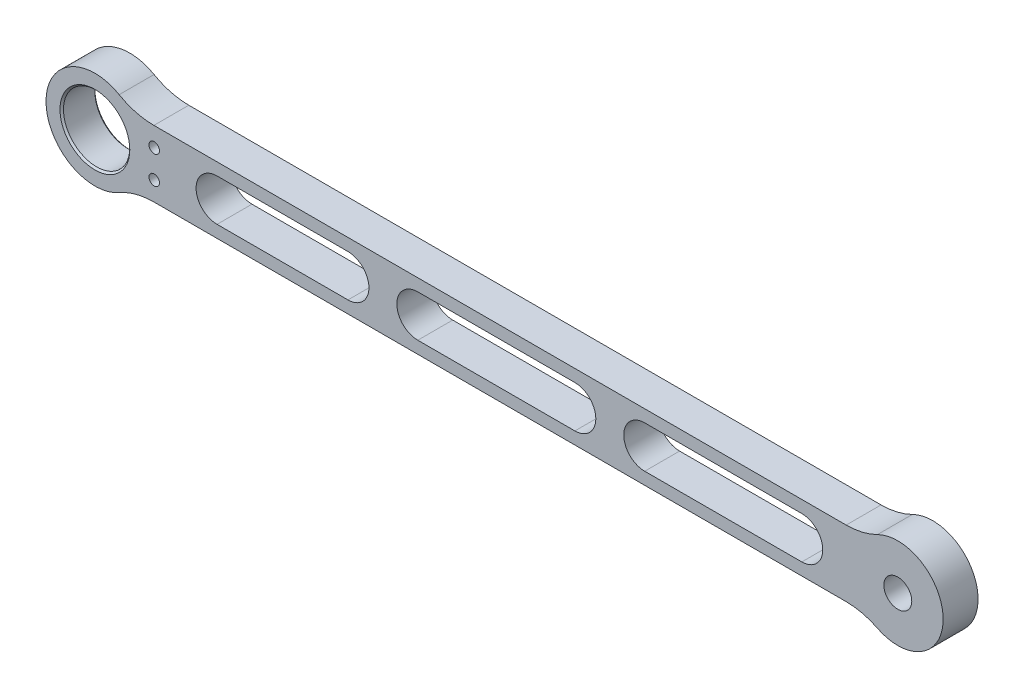
ISO-10303-21;
HEADER;
FILE_DESCRIPTION(('STEP AP214'),'2;1');
FILE_NAME('part.step','',(''),(''),'','','');
FILE_SCHEMA(('AUTOMOTIVE_DESIGN { 1 0 10303 214 1 1 1 1 }'));
ENDSEC;
DATA;
#1=APPLICATION_CONTEXT('core data for automotive mechanical design processes');
#2=APPLICATION_PROTOCOL_DEFINITION('international standard','automotive_design',2000,#1);
#3=PRODUCT_CONTEXT('',#1,'mechanical');
#4=PRODUCT('Part','Part','',(#3));
#5=PRODUCT_RELATED_PRODUCT_CATEGORY('part','',(#4));
#6=PRODUCT_DEFINITION_FORMATION('','',#4);
#7=PRODUCT_DEFINITION_CONTEXT('part definition',#1,'design');
#8=PRODUCT_DEFINITION('design','',#6,#7);
#9=PRODUCT_DEFINITION_SHAPE('','',#8);
#10=(LENGTH_UNIT() NAMED_UNIT(*) SI_UNIT(.MILLI.,.METRE.));
#11=(NAMED_UNIT(*) PLANE_ANGLE_UNIT() SI_UNIT($,.RADIAN.));
#12=(NAMED_UNIT(*) SI_UNIT($,.STERADIAN.) SOLID_ANGLE_UNIT());
#13=UNCERTAINTY_MEASURE_WITH_UNIT(LENGTH_MEASURE(1.E-05),#10,'distance_accuracy_value','');
#14=(GEOMETRIC_REPRESENTATION_CONTEXT(3) GLOBAL_UNCERTAINTY_ASSIGNED_CONTEXT((#13)) GLOBAL_UNIT_ASSIGNED_CONTEXT((#10,
#11,#12)) REPRESENTATION_CONTEXT('',''));
#15=CARTESIAN_POINT('',(0.,0.,0.));
#16=DIRECTION('',(0.,0.,1.));
#17=DIRECTION('',(1.,0.,0.));
#18=AXIS2_PLACEMENT_3D('',#15,#16,#17);
#19=CARTESIAN_POINT('',(215.20980054225,-29.5,10.));
#20=DIRECTION('',(0.,0.,-1.));
#21=DIRECTION('',(-1.,0.,0.));
#22=AXIS2_PLACEMENT_3D('',#19,#20,#21);
#23=CYLINDRICAL_SURFACE('',#22,20.);
#24=CARTESIAN_POINT('',(215.20980054225,-29.5,0.));
#25=DIRECTION('',(0.,0.,1.));
#26=DIRECTION('',(1.,0.,0.));
#27=AXIS2_PLACEMENT_3D('',#24,#25,#26);
#28=CIRCLE('',#27,20.);
#29=CARTESIAN_POINT('',(215.20980054225,-9.5,0.));
#30=VERTEX_POINT('',#29);
#31=CARTESIAN_POINT('',(224.173557789371,-11.6212121212123,0.));
#32=VERTEX_POINT('',#31);
#33=EDGE_CURVE('E274',#30,#32,#28,.F.);
#34=ORIENTED_EDGE('',*,*,#33,.T.);
#35=DIRECTION('',(0.,0.,-1.));
#36=VECTOR('',#35,1.);
#37=CARTESIAN_POINT('',(224.173557789371,-11.6212121212123,10.));
#38=LINE('',#37,#36);
#39=CARTESIAN_POINT('',(224.173557789371,-11.6212121212123,10.));
#40=VERTEX_POINT('',#39);
#41=EDGE_CURVE('E338',#40,#32,#38,.T.);
#42=ORIENTED_EDGE('',*,*,#41,.F.);
#43=CARTESIAN_POINT('',(215.20980054225,-29.5,10.));
#44=DIRECTION('',(0.,0.,1.));
#45=DIRECTION('',(1.,0.,0.));
#46=AXIS2_PLACEMENT_3D('',#43,#44,#45);
#47=CIRCLE('',#46,20.);
#48=CARTESIAN_POINT('',(215.20980054225,-9.5,10.));
#49=VERTEX_POINT('',#48);
#50=EDGE_CURVE('E281',#49,#40,#47,.F.);
#51=ORIENTED_EDGE('',*,*,#50,.F.);
#52=DIRECTION('',(0.,0.,-1.));
#53=VECTOR('',#52,1.);
#54=CARTESIAN_POINT('',(215.20980054225,-9.5,10.));
#55=LINE('',#54,#53);
#56=EDGE_CURVE('E302',#49,#30,#55,.T.);
#57=ORIENTED_EDGE('',*,*,#56,.T.);
#58=EDGE_LOOP('',(#34,#42,#51,#57));
#59=FACE_BOUND('',#58,.T.);
#60=ADVANCED_FACE('F38',(#59),#23,.F.);
#61=CARTESIAN_POINT('',(230.,0.,10.));
#62=DIRECTION('',(0.,0.,-1.));
#63=DIRECTION('',(-1.,0.,0.));
#64=AXIS2_PLACEMENT_3D('',#61,#62,#63);
#65=CYLINDRICAL_SURFACE('',#64,13.0000000000003);
#66=CARTESIAN_POINT('',(230.,0.,0.));
#67=DIRECTION('',(0.,0.,1.));
#68=DIRECTION('',(1.,0.,0.));
#69=AXIS2_PLACEMENT_3D('',#66,#67,#68);
#70=CIRCLE('',#69,13.0000000000003);
#71=CARTESIAN_POINT('',(224.173557789371,11.6212121212123,0.));
#72=VERTEX_POINT('',#71);
#73=EDGE_CURVE('E305',#32,#72,#70,.T.);
#74=ORIENTED_EDGE('',*,*,#73,.T.);
#75=DIRECTION('',(0.,0.,-1.));
#76=VECTOR('',#75,1.);
#77=CARTESIAN_POINT('',(224.173557789371,11.6212121212123,10.));
#78=LINE('',#77,#76);
#79=CARTESIAN_POINT('',(224.173557789371,11.6212121212123,10.));
#80=VERTEX_POINT('',#79);
#81=EDGE_CURVE('E335',#80,#72,#78,.T.);
#82=ORIENTED_EDGE('',*,*,#81,.F.);
#83=CARTESIAN_POINT('',(230.,0.,10.));
#84=DIRECTION('',(0.,0.,1.));
#85=DIRECTION('',(1.,0.,0.));
#86=AXIS2_PLACEMENT_3D('',#83,#84,#85);
#87=CIRCLE('',#86,13.0000000000003);
#88=EDGE_CURVE('E284',#40,#80,#87,.T.);
#89=ORIENTED_EDGE('',*,*,#88,.F.);
#90=ORIENTED_EDGE('',*,*,#41,.T.);
#91=EDGE_LOOP('',(#74,#82,#89,#90));
#92=FACE_BOUND('',#91,.T.);
#93=ADVANCED_FACE('F429',(#92),#65,.T.);
#94=CARTESIAN_POINT('',(215.20980054225,29.5,10.));
#95=DIRECTION('',(0.,0.,-1.));
#96=DIRECTION('',(-1.,0.,0.));
#97=AXIS2_PLACEMENT_3D('',#94,#95,#96);
#98=CYLINDRICAL_SURFACE('',#97,20.);
#99=CARTESIAN_POINT('',(215.20980054225,29.5,0.));
#100=DIRECTION('',(0.,0.,1.));
#101=DIRECTION('',(1.,0.,0.));
#102=AXIS2_PLACEMENT_3D('',#99,#100,#101);
#103=CIRCLE('',#102,20.);
#104=CARTESIAN_POINT('',(215.20980054225,9.50000000000002,0.));
#105=VERTEX_POINT('',#104);
#106=EDGE_CURVE('E307',#72,#105,#103,.F.);
#107=ORIENTED_EDGE('',*,*,#106,.T.);
#108=DIRECTION('',(0.,0.,-1.));
#109=VECTOR('',#108,1.);
#110=CARTESIAN_POINT('',(215.20980054225,9.50000000000002,10.));
#111=LINE('',#110,#109);
#112=CARTESIAN_POINT('',(215.20980054225,9.50000000000002,10.));
#113=VERTEX_POINT('',#112);
#114=EDGE_CURVE('E333',#113,#105,#111,.T.);
#115=ORIENTED_EDGE('',*,*,#114,.F.);
#116=CARTESIAN_POINT('',(215.20980054225,29.5,10.));
#117=DIRECTION('',(0.,0.,1.));
#118=DIRECTION('',(1.,0.,0.));
#119=AXIS2_PLACEMENT_3D('',#116,#117,#118);
#120=CIRCLE('',#119,20.);
#121=EDGE_CURVE('E287',#80,#113,#120,.F.);
#122=ORIENTED_EDGE('',*,*,#121,.F.);
#123=ORIENTED_EDGE('',*,*,#81,.T.);
#124=EDGE_LOOP('',(#107,#115,#122,#123));
#125=FACE_BOUND('',#124,.T.);
#126=ADVANCED_FACE('F435',(#125),#98,.F.);
#127=CARTESIAN_POINT('',(0.,9.50000000000018,10.));
#128=DIRECTION('',(0.,1.,0.));
#129=DIRECTION('',(-1.,0.,0.));
#130=AXIS2_PLACEMENT_3D('',#127,#128,#129);
#131=PLANE('',#130);
#132=DIRECTION('',(1.,0.,0.));
#133=VECTOR('',#132,1.);
#134=CARTESIAN_POINT('',(0.,9.50000000000018,0.));
#135=LINE('',#134,#133);
#136=CARTESIAN_POINT('',(16.904141504377,9.49999999999997,0.));
#137=VERTEX_POINT('',#136);
#138=EDGE_CURVE('E310',#137,#105,#135,.T.);
#139=ORIENTED_EDGE('',*,*,#138,.F.);
#140=DIRECTION('',(0.,0.,-1.));
#141=VECTOR('',#140,1.);
#142=CARTESIAN_POINT('',(16.904141504377,9.49999999999997,10.));
#143=LINE('',#142,#141);
#144=CARTESIAN_POINT('',(16.904141504377,9.49999999999997,10.));
#145=VERTEX_POINT('',#144);
#146=EDGE_CURVE('E331',#145,#137,#143,.T.);
#147=ORIENTED_EDGE('',*,*,#146,.F.);
#148=DIRECTION('',(1.,0.,0.));
#149=VECTOR('',#148,1.);
#150=CARTESIAN_POINT('',(0.,9.50000000000018,10.));
#151=LINE('',#150,#149);
#152=EDGE_CURVE('E289',#145,#113,#151,.T.);
#153=ORIENTED_EDGE('',*,*,#152,.T.);
#154=ORIENTED_EDGE('',*,*,#114,.T.);
#155=EDGE_LOOP('',(#139,#147,#153,#154));
#156=FACE_BOUND('',#155,.T.);
#157=ADVANCED_FACE('F441',(#156),#131,.T.);
#158=CARTESIAN_POINT('',(16.904141504377,29.5,10.));
#159=DIRECTION('',(0.,0.,-1.));
#160=DIRECTION('',(-1.,0.,0.));
#161=AXIS2_PLACEMENT_3D('',#158,#159,#160);
#162=CYLINDRICAL_SURFACE('',#161,20.);
#163=CARTESIAN_POINT('',(16.904141504377,29.5,0.));
#164=DIRECTION('',(0.,0.,1.));
#165=DIRECTION('',(1.,0.,0.));
#166=AXIS2_PLACEMENT_3D('',#163,#164,#165);
#167=CIRCLE('',#166,20.);
#168=CARTESIAN_POINT('',(6.96052885474347,12.1470588235294,0.));
#169=VERTEX_POINT('',#168);
#170=EDGE_CURVE('E313',#169,#137,#167,.T.);
#171=ORIENTED_EDGE('',*,*,#170,.F.);
#172=DIRECTION('',(0.,0.,-1.));
#173=VECTOR('',#172,1.);
#174=CARTESIAN_POINT('',(6.96052885474347,12.1470588235294,10.));
#175=LINE('',#174,#173);
#176=CARTESIAN_POINT('',(6.96052885474347,12.1470588235294,10.));
#177=VERTEX_POINT('',#176);
#178=EDGE_CURVE('E329',#177,#169,#175,.T.);
#179=ORIENTED_EDGE('',*,*,#178,.F.);
#180=CARTESIAN_POINT('',(16.904141504377,29.5,10.));
#181=DIRECTION('',(0.,0.,1.));
#182=DIRECTION('',(1.,0.,0.));
#183=AXIS2_PLACEMENT_3D('',#180,#181,#182);
#184=CIRCLE('',#183,20.);
#185=EDGE_CURVE('E292',#177,#145,#184,.T.);
#186=ORIENTED_EDGE('',*,*,#185,.T.);
#187=ORIENTED_EDGE('',*,*,#146,.T.);
#188=EDGE_LOOP('',(#171,#179,#186,#187));
#189=FACE_BOUND('',#188,.T.);
#190=ADVANCED_FACE('F445',(#189),#162,.F.);
#191=CARTESIAN_POINT('',(0.,0.,10.));
#192=DIRECTION('',(0.,0.,-1.));
#193=DIRECTION('',(-1.,0.,0.));
#194=AXIS2_PLACEMENT_3D('',#191,#192,#193);
#195=CYLINDRICAL_SURFACE('',#194,14.);
#196=CARTESIAN_POINT('',(0.,0.,0.));
#197=DIRECTION('',(0.,0.,1.));
#198=DIRECTION('',(1.,0.,0.));
#199=AXIS2_PLACEMENT_3D('',#196,#197,#198);
#200=CIRCLE('',#199,14.);
#201=CARTESIAN_POINT('',(6.96052885474344,-12.1470588235294,0.));
#202=VERTEX_POINT('',#201);
#203=EDGE_CURVE('E316',#169,#202,#200,.T.);
#204=ORIENTED_EDGE('',*,*,#203,.T.);
#205=DIRECTION('',(0.,0.,-1.));
#206=VECTOR('',#205,1.);
#207=CARTESIAN_POINT('',(6.96052885474344,-12.1470588235294,10.));
#208=LINE('',#207,#206);
#209=CARTESIAN_POINT('',(6.96052885474344,-12.1470588235294,10.));
#210=VERTEX_POINT('',#209);
#211=EDGE_CURVE('E326',#210,#202,#208,.T.);
#212=ORIENTED_EDGE('',*,*,#211,.F.);
#213=CARTESIAN_POINT('',(0.,0.,10.));
#214=DIRECTION('',(0.,0.,1.));
#215=DIRECTION('',(1.,0.,0.));
#216=AXIS2_PLACEMENT_3D('',#213,#214,#215);
#217=CIRCLE('',#216,14.);
#218=EDGE_CURVE('E295',#177,#210,#217,.T.);
#219=ORIENTED_EDGE('',*,*,#218,.F.);
#220=ORIENTED_EDGE('',*,*,#178,.T.);
#221=EDGE_LOOP('',(#204,#212,#219,#220));
#222=FACE_BOUND('',#221,.T.);
#223=ADVANCED_FACE('F449',(#222),#195,.T.);
#224=CARTESIAN_POINT('',(16.9041415043769,-29.5,10.));
#225=DIRECTION('',(0.,0.,-1.));
#226=DIRECTION('',(-1.,0.,0.));
#227=AXIS2_PLACEMENT_3D('',#224,#225,#226);
#228=CYLINDRICAL_SURFACE('',#227,20.);
#229=CARTESIAN_POINT('',(16.9041415043769,-29.5,0.));
#230=DIRECTION('',(0.,0.,1.));
#231=DIRECTION('',(1.,0.,0.));
#232=AXIS2_PLACEMENT_3D('',#229,#230,#231);
#233=CIRCLE('',#232,20.);
#234=CARTESIAN_POINT('',(16.9041415043769,-9.50000000000002,0.));
#235=VERTEX_POINT('',#234);
#236=EDGE_CURVE('E318',#202,#235,#233,.F.);
#237=ORIENTED_EDGE('',*,*,#236,.T.);
#238=DIRECTION('',(0.,0.,-1.));
#239=VECTOR('',#238,1.);
#240=CARTESIAN_POINT('',(16.9041415043769,-9.50000000000002,10.));
#241=LINE('',#240,#239);
#242=CARTESIAN_POINT('',(16.9041415043769,-9.50000000000002,10.));
#243=VERTEX_POINT('',#242);
#244=EDGE_CURVE('E324',#243,#235,#241,.T.);
#245=ORIENTED_EDGE('',*,*,#244,.F.);
#246=CARTESIAN_POINT('',(16.9041415043769,-29.5,10.));
#247=DIRECTION('',(0.,0.,1.));
#248=DIRECTION('',(1.,0.,0.));
#249=AXIS2_PLACEMENT_3D('',#246,#247,#248);
#250=CIRCLE('',#249,20.);
#251=EDGE_CURVE('E297',#210,#243,#250,.F.);
#252=ORIENTED_EDGE('',*,*,#251,.F.);
#253=ORIENTED_EDGE('',*,*,#211,.T.);
#254=EDGE_LOOP('',(#237,#245,#252,#253));
#255=FACE_BOUND('',#254,.T.);
#256=ADVANCED_FACE('F453',(#255),#228,.F.);
#257=CARTESIAN_POINT('',(0.,0.,10.));
#258=DIRECTION('',(0.,0.,-1.));
#259=DIRECTION('',(-1.,0.,0.));
#260=AXIS2_PLACEMENT_3D('',#257,#258,#259);
#261=CYLINDRICAL_SURFACE('',#260,9.5);
#262=CARTESIAN_POINT('',(0.,0.,0.500000000000032));
#263=DIRECTION('',(0.,0.,1.));
#264=DIRECTION('',(1.,0.,0.));
#265=AXIS2_PLACEMENT_3D('',#262,#263,#264);
#266=CIRCLE('',#265,9.5);
#267=CARTESIAN_POINT('',(9.5,0.,0.500000000000032));
#268=VERTEX_POINT('',#267);
#269=EDGE_CURVE('E46',#268,#268,#266,.F.);
#270=ORIENTED_EDGE('',*,*,#269,.T.);
#271=EDGE_LOOP('',(#270));
#272=FACE_BOUND('',#271,.T.);
#273=CARTESIAN_POINT('',(0.,0.,9.49999999999993));
#274=DIRECTION('',(0.,0.,1.));
#275=DIRECTION('',(1.,0.,0.));
#276=AXIS2_PLACEMENT_3D('',#273,#274,#275);
#277=CIRCLE('',#276,9.5);
#278=CARTESIAN_POINT('',(9.5,0.,9.49999999999993));
#279=VERTEX_POINT('',#278);
#280=EDGE_CURVE('E344',#279,#279,#277,.T.);
#281=ORIENTED_EDGE('',*,*,#280,.T.);
#282=EDGE_LOOP('',(#281));
#283=FACE_BOUND('',#282,.T.);
#284=ADVANCED_FACE('F349',(#272,#283),#261,.F.);
#285=CARTESIAN_POINT('',(0.,-9.50000000000002,10.));
#286=DIRECTION('',(0.,-1.,0.));
#287=DIRECTION('',(1.,0.,0.));
#288=AXIS2_PLACEMENT_3D('',#285,#286,#287);
#289=PLANE('',#288);
#290=DIRECTION('',(-1.,0.,0.));
#291=VECTOR('',#290,1.);
#292=CARTESIAN_POINT('',(0.,-9.50000000000002,0.));
#293=LINE('',#292,#291);
#294=EDGE_CURVE('E285',#30,#235,#293,.T.);
#295=ORIENTED_EDGE('',*,*,#294,.F.);
#296=ORIENTED_EDGE('',*,*,#56,.F.);
#297=DIRECTION('',(-1.,0.,0.));
#298=VECTOR('',#297,1.);
#299=CARTESIAN_POINT('',(0.,-9.50000000000002,10.));
#300=LINE('',#299,#298);
#301=EDGE_CURVE('E299',#49,#243,#300,.T.);
#302=ORIENTED_EDGE('',*,*,#301,.T.);
#303=ORIENTED_EDGE('',*,*,#244,.T.);
#304=EDGE_LOOP('',(#295,#296,#302,#303));
#305=FACE_BOUND('',#304,.T.);
#306=ADVANCED_FACE('F393',(#305),#289,.T.);
#307=CARTESIAN_POINT('',(0.,0.,10.));
#308=DIRECTION('',(0.,0.,1.));
#309=DIRECTION('',(1.,0.,0.));
#310=AXIS2_PLACEMENT_3D('',#307,#308,#309);
#311=PLANE('',#310);
#312=CARTESIAN_POINT('',(17.,4.,10.));
#313=DIRECTION('',(0.,0.,1.));
#314=DIRECTION('',(1.,0.,0.));
#315=AXIS2_PLACEMENT_3D('',#312,#313,#314);
#316=CIRCLE('',#315,1.5);
#317=CARTESIAN_POINT('',(18.5,4.,10.));
#318=VERTEX_POINT('',#317);
#319=EDGE_CURVE('E377',#318,#318,#316,.T.);
#320=ORIENTED_EDGE('',*,*,#319,.F.);
#321=EDGE_LOOP('',(#320));
#322=FACE_BOUND('',#321,.T.);
#323=CARTESIAN_POINT('',(17.,-4.,10.));
#324=DIRECTION('',(0.,0.,1.));
#325=DIRECTION('',(1.,0.,0.));
#326=AXIS2_PLACEMENT_3D('',#323,#324,#325);
#327=CIRCLE('',#326,1.5);
#328=CARTESIAN_POINT('',(18.5,-4.,10.));
#329=VERTEX_POINT('',#328);
#330=EDGE_CURVE('E371',#329,#329,#327,.T.);
#331=ORIENTED_EDGE('',*,*,#330,.F.);
#332=EDGE_LOOP('',(#331));
#333=FACE_BOUND('',#332,.T.);
#334=CARTESIAN_POINT('',(202.5,0.,10.));
#335=DIRECTION('',(0.,0.,1.));
#336=DIRECTION('',(1.,0.,0.));
#337=AXIS2_PLACEMENT_3D('',#334,#335,#336);
#338=CIRCLE('',#337,6.);
#339=CARTESIAN_POINT('',(202.5,-6.,10.));
#340=VERTEX_POINT('',#339);
#341=CARTESIAN_POINT('',(202.5,6.,10.));
#342=VERTEX_POINT('',#341);
#343=EDGE_CURVE('E53',#340,#342,#338,.T.);
#344=ORIENTED_EDGE('',*,*,#343,.F.);
#345=DIRECTION('',(1.,0.,0.));
#346=VECTOR('',#345,1.);
#347=CARTESIAN_POINT('',(157.5,-6.,10.));
#348=LINE('',#347,#346);
#349=CARTESIAN_POINT('',(157.5,-5.99999999999999,10.));
#350=VERTEX_POINT('',#349);
#351=EDGE_CURVE('E223',#350,#340,#348,.T.);
#352=ORIENTED_EDGE('',*,*,#351,.F.);
#353=CARTESIAN_POINT('',(157.5,0.,10.));
#354=DIRECTION('',(0.,0.,1.));
#355=DIRECTION('',(1.,0.,0.));
#356=AXIS2_PLACEMENT_3D('',#353,#354,#355);
#357=CIRCLE('',#356,6.);
#358=CARTESIAN_POINT('',(157.5,6.,10.));
#359=VERTEX_POINT('',#358);
#360=EDGE_CURVE('E238',#359,#350,#357,.T.);
#361=ORIENTED_EDGE('',*,*,#360,.F.);
#362=DIRECTION('',(-1.,0.,0.));
#363=VECTOR('',#362,1.);
#364=CARTESIAN_POINT('',(157.5,6.,10.));
#365=LINE('',#364,#363);
#366=EDGE_CURVE('E234',#342,#359,#365,.T.);
#367=ORIENTED_EDGE('',*,*,#366,.F.);
#368=EDGE_LOOP('',(#344,#352,#361,#367));
#369=FACE_BOUND('',#368,.T.);
#370=CARTESIAN_POINT('',(72.5000000000001,0.,10.));
#371=DIRECTION('',(0.,0.,1.));
#372=DIRECTION('',(1.,0.,0.));
#373=AXIS2_PLACEMENT_3D('',#370,#371,#372);
#374=CIRCLE('',#373,6.);
#375=CARTESIAN_POINT('',(72.5000000000001,-6.,10.));
#376=VERTEX_POINT('',#375);
#377=CARTESIAN_POINT('',(72.5000000000001,6.,10.));
#378=VERTEX_POINT('',#377);
#379=EDGE_CURVE('E61',#376,#378,#374,.T.);
#380=ORIENTED_EDGE('',*,*,#379,.F.);
#381=DIRECTION('',(1.,0.,0.));
#382=VECTOR('',#381,1.);
#383=CARTESIAN_POINT('',(35.,-6.,10.));
#384=LINE('',#383,#382);
#385=CARTESIAN_POINT('',(35.,-6.,10.));
#386=VERTEX_POINT('',#385);
#387=EDGE_CURVE('E196',#386,#376,#384,.T.);
#388=ORIENTED_EDGE('',*,*,#387,.F.);
#389=CARTESIAN_POINT('',(35.,0.,10.));
#390=DIRECTION('',(0.,0.,1.));
#391=DIRECTION('',(1.,0.,0.));
#392=AXIS2_PLACEMENT_3D('',#389,#390,#391);
#393=CIRCLE('',#392,6.);
#394=CARTESIAN_POINT('',(35.,6.,10.));
#395=VERTEX_POINT('',#394);
#396=EDGE_CURVE('E199',#395,#386,#393,.T.);
#397=ORIENTED_EDGE('',*,*,#396,.F.);
#398=DIRECTION('',(-1.,0.,0.));
#399=VECTOR('',#398,1.);
#400=CARTESIAN_POINT('',(35.,6.,10.));
#401=LINE('',#400,#399);
#402=EDGE_CURVE('E208',#378,#395,#401,.T.);
#403=ORIENTED_EDGE('',*,*,#402,.F.);
#404=EDGE_LOOP('',(#380,#388,#397,#403));
#405=FACE_BOUND('',#404,.T.);
#406=CARTESIAN_POINT('',(92.5,0.,10.));
#407=DIRECTION('',(0.,0.,1.));
#408=DIRECTION('',(1.,0.,0.));
#409=AXIS2_PLACEMENT_3D('',#406,#407,#408);
#410=CIRCLE('',#409,6.);
#411=CARTESIAN_POINT('',(92.5,6.,10.));
#412=VERTEX_POINT('',#411);
#413=CARTESIAN_POINT('',(92.5,-6.,10.));
#414=VERTEX_POINT('',#413);
#415=EDGE_CURVE('E215',#412,#414,#410,.T.);
#416=ORIENTED_EDGE('',*,*,#415,.F.);
#417=DIRECTION('',(-1.,0.,0.));
#418=VECTOR('',#417,1.);
#419=CARTESIAN_POINT('',(137.499999917682,6.,10.));
#420=LINE('',#419,#418);
#421=CARTESIAN_POINT('',(137.499999917682,6.,10.));
#422=VERTEX_POINT('',#421);
#423=EDGE_CURVE('E253',#422,#412,#420,.T.);
#424=ORIENTED_EDGE('',*,*,#423,.F.);
#425=CARTESIAN_POINT('',(137.499999917682,0.,10.));
#426=DIRECTION('',(0.,0.,1.));
#427=DIRECTION('',(1.,0.,0.));
#428=AXIS2_PLACEMENT_3D('',#425,#426,#427);
#429=CIRCLE('',#428,6.);
#430=CARTESIAN_POINT('',(137.499999917682,-6.,10.));
#431=VERTEX_POINT('',#430);
#432=EDGE_CURVE('E267',#431,#422,#429,.T.);
#433=ORIENTED_EDGE('',*,*,#432,.F.);
#434=DIRECTION('',(1.,0.,0.));
#435=VECTOR('',#434,1.);
#436=CARTESIAN_POINT('',(137.499999917682,-6.,10.));
#437=LINE('',#436,#435);
#438=EDGE_CURVE('E264',#414,#431,#437,.T.);
#439=ORIENTED_EDGE('',*,*,#438,.F.);
#440=EDGE_LOOP('',(#416,#424,#433,#439));
#441=FACE_BOUND('',#440,.T.);
#442=CARTESIAN_POINT('',(0.,0.,10.));
#443=DIRECTION('',(0.,0.,1.));
#444=DIRECTION('',(1.,0.,0.));
#445=AXIS2_PLACEMENT_3D('',#442,#443,#444);
#446=CIRCLE('',#445,10.0000000000001);
#447=CARTESIAN_POINT('',(10.0000000000001,0.,10.));
#448=VERTEX_POINT('',#447);
#449=EDGE_CURVE('E11',#448,#448,#446,.F.);
#450=ORIENTED_EDGE('',*,*,#449,.T.);
#451=EDGE_LOOP('',(#450));
#452=FACE_BOUND('',#451,.T.);
#453=ORIENTED_EDGE('',*,*,#50,.T.);
#454=ORIENTED_EDGE('',*,*,#88,.T.);
#455=ORIENTED_EDGE('',*,*,#121,.T.);
#456=ORIENTED_EDGE('',*,*,#152,.F.);
#457=ORIENTED_EDGE('',*,*,#185,.F.);
#458=ORIENTED_EDGE('',*,*,#218,.T.);
#459=ORIENTED_EDGE('',*,*,#251,.T.);
#460=ORIENTED_EDGE('',*,*,#301,.F.);
#461=EDGE_LOOP('',(#453,#454,#455,#456,#457,#458,#459,#460));
#462=FACE_BOUND('',#461,.T.);
#463=CARTESIAN_POINT('',(230.,0.,10.));
#464=DIRECTION('',(0.,0.,1.));
#465=DIRECTION('',(1.,0.,0.));
#466=AXIS2_PLACEMENT_3D('',#463,#464,#465);
#467=CIRCLE('',#466,3.99999999999999);
#468=CARTESIAN_POINT('',(234.,0.,10.));
#469=VERTEX_POINT('',#468);
#470=EDGE_CURVE('E202',#469,#469,#467,.T.);
#471=ORIENTED_EDGE('',*,*,#470,.F.);
#472=EDGE_LOOP('',(#471));
#473=FACE_BOUND('',#472,.T.);
#474=ADVANCED_FACE('F359',(#322,#333,#369,#405,#441,#452,#462,#473),#311,.T.);
#475=CARTESIAN_POINT('',(0.,0.,0.));
#476=DIRECTION('',(0.,0.,1.));
#477=DIRECTION('',(1.,0.,0.));
#478=AXIS2_PLACEMENT_3D('',#475,#476,#477);
#479=PLANE('',#478);
#480=CARTESIAN_POINT('',(17.,4.,0.));
#481=DIRECTION('',(0.,0.,1.));
#482=DIRECTION('',(1.,0.,0.));
#483=AXIS2_PLACEMENT_3D('',#480,#481,#482);
#484=CIRCLE('',#483,1.5);
#485=CARTESIAN_POINT('',(18.5,4.,0.));
#486=VERTEX_POINT('',#485);
#487=EDGE_CURVE('E369',#486,#486,#484,.T.);
#488=ORIENTED_EDGE('',*,*,#487,.T.);
#489=EDGE_LOOP('',(#488));
#490=FACE_BOUND('',#489,.T.);
#491=CARTESIAN_POINT('',(17.,-4.,0.));
#492=DIRECTION('',(0.,0.,1.));
#493=DIRECTION('',(1.,0.,0.));
#494=AXIS2_PLACEMENT_3D('',#491,#492,#493);
#495=CIRCLE('',#494,1.5);
#496=CARTESIAN_POINT('',(18.5,-4.,0.));
#497=VERTEX_POINT('',#496);
#498=EDGE_CURVE('E374',#497,#497,#495,.T.);
#499=ORIENTED_EDGE('',*,*,#498,.T.);
#500=EDGE_LOOP('',(#499));
#501=FACE_BOUND('',#500,.T.);
#502=DIRECTION('',(1.,0.,0.));
#503=VECTOR('',#502,1.);
#504=CARTESIAN_POINT('',(157.5,-6.,0.));
#505=LINE('',#504,#503);
#506=CARTESIAN_POINT('',(157.5,-5.99999999999999,0.));
#507=VERTEX_POINT('',#506);
#508=CARTESIAN_POINT('',(202.5,-6.,0.));
#509=VERTEX_POINT('',#508);
#510=EDGE_CURVE('E229',#507,#509,#505,.T.);
#511=ORIENTED_EDGE('',*,*,#510,.T.);
#512=CARTESIAN_POINT('',(202.5,0.,0.));
#513=DIRECTION('',(0.,0.,1.));
#514=DIRECTION('',(1.,0.,0.));
#515=AXIS2_PLACEMENT_3D('',#512,#513,#514);
#516=CIRCLE('',#515,6.);
#517=CARTESIAN_POINT('',(202.5,6.,0.));
#518=VERTEX_POINT('',#517);
#519=EDGE_CURVE('E219',#509,#518,#516,.T.);
#520=ORIENTED_EDGE('',*,*,#519,.T.);
#521=DIRECTION('',(-1.,0.,0.));
#522=VECTOR('',#521,1.);
#523=CARTESIAN_POINT('',(157.5,6.,0.));
#524=LINE('',#523,#522);
#525=CARTESIAN_POINT('',(157.5,6.,0.));
#526=VERTEX_POINT('',#525);
#527=EDGE_CURVE('E222',#518,#526,#524,.T.);
#528=ORIENTED_EDGE('',*,*,#527,.T.);
#529=CARTESIAN_POINT('',(157.5,0.,0.));
#530=DIRECTION('',(0.,0.,1.));
#531=DIRECTION('',(1.,0.,0.));
#532=AXIS2_PLACEMENT_3D('',#529,#530,#531);
#533=CIRCLE('',#532,6.);
#534=EDGE_CURVE('E226',#526,#507,#533,.T.);
#535=ORIENTED_EDGE('',*,*,#534,.T.);
#536=EDGE_LOOP('',(#511,#520,#528,#535));
#537=FACE_BOUND('',#536,.T.);
#538=DIRECTION('',(1.,0.,0.));
#539=VECTOR('',#538,1.);
#540=CARTESIAN_POINT('',(35.,-6.,0.));
#541=LINE('',#540,#539);
#542=CARTESIAN_POINT('',(35.,-6.,0.));
#543=VERTEX_POINT('',#542);
#544=CARTESIAN_POINT('',(72.5000000000001,-6.,0.));
#545=VERTEX_POINT('',#544);
#546=EDGE_CURVE('E183',#543,#545,#541,.T.);
#547=ORIENTED_EDGE('',*,*,#546,.T.);
#548=CARTESIAN_POINT('',(72.5000000000001,0.,0.));
#549=DIRECTION('',(0.,0.,1.));
#550=DIRECTION('',(1.,0.,0.));
#551=AXIS2_PLACEMENT_3D('',#548,#549,#550);
#552=CIRCLE('',#551,6.);
#553=CARTESIAN_POINT('',(72.5000000000001,6.,0.));
#554=VERTEX_POINT('',#553);
#555=EDGE_CURVE('E177',#545,#554,#552,.T.);
#556=ORIENTED_EDGE('',*,*,#555,.T.);
#557=DIRECTION('',(-1.,0.,0.));
#558=VECTOR('',#557,1.);
#559=CARTESIAN_POINT('',(35.,6.,0.));
#560=LINE('',#559,#558);
#561=CARTESIAN_POINT('',(35.,6.,0.));
#562=VERTEX_POINT('',#561);
#563=EDGE_CURVE('E187',#554,#562,#560,.T.);
#564=ORIENTED_EDGE('',*,*,#563,.T.);
#565=CARTESIAN_POINT('',(35.,0.,0.));
#566=DIRECTION('',(0.,0.,1.));
#567=DIRECTION('',(1.,0.,0.));
#568=AXIS2_PLACEMENT_3D('',#565,#566,#567);
#569=CIRCLE('',#568,6.);
#570=EDGE_CURVE('E191',#562,#543,#569,.T.);
#571=ORIENTED_EDGE('',*,*,#570,.T.);
#572=EDGE_LOOP('',(#547,#556,#564,#571));
#573=FACE_BOUND('',#572,.T.);
#574=DIRECTION('',(-1.,0.,0.));
#575=VECTOR('',#574,1.);
#576=CARTESIAN_POINT('',(137.499999917682,6.,0.));
#577=LINE('',#576,#575);
#578=CARTESIAN_POINT('',(137.499999917682,6.,0.));
#579=VERTEX_POINT('',#578);
#580=CARTESIAN_POINT('',(92.5,6.,0.));
#581=VERTEX_POINT('',#580);
#582=EDGE_CURVE('E259',#579,#581,#577,.T.);
#583=ORIENTED_EDGE('',*,*,#582,.T.);
#584=CARTESIAN_POINT('',(92.5,0.,0.));
#585=DIRECTION('',(0.,0.,1.));
#586=DIRECTION('',(1.,0.,0.));
#587=AXIS2_PLACEMENT_3D('',#584,#585,#586);
#588=CIRCLE('',#587,6.);
#589=CARTESIAN_POINT('',(92.5,-6.,0.));
#590=VERTEX_POINT('',#589);
#591=EDGE_CURVE('E249',#581,#590,#588,.T.);
#592=ORIENTED_EDGE('',*,*,#591,.T.);
#593=DIRECTION('',(1.,0.,0.));
#594=VECTOR('',#593,1.);
#595=CARTESIAN_POINT('',(137.499999917682,-6.,0.));
#596=LINE('',#595,#594);
#597=CARTESIAN_POINT('',(137.499999917682,-6.,0.));
#598=VERTEX_POINT('',#597);
#599=EDGE_CURVE('E252',#590,#598,#596,.T.);
#600=ORIENTED_EDGE('',*,*,#599,.T.);
#601=CARTESIAN_POINT('',(137.499999917682,0.,0.));
#602=DIRECTION('',(0.,0.,1.));
#603=DIRECTION('',(1.,0.,0.));
#604=AXIS2_PLACEMENT_3D('',#601,#602,#603);
#605=CIRCLE('',#604,6.);
#606=EDGE_CURVE('E256',#598,#579,#605,.T.);
#607=ORIENTED_EDGE('',*,*,#606,.T.);
#608=EDGE_LOOP('',(#583,#592,#600,#607));
#609=FACE_BOUND('',#608,.T.);
#610=CARTESIAN_POINT('',(0.,0.,0.));
#611=DIRECTION('',(0.,0.,1.));
#612=DIRECTION('',(1.,0.,0.));
#613=AXIS2_PLACEMENT_3D('',#610,#611,#612);
#614=CIRCLE('',#613,10.0000000000001);
#615=CARTESIAN_POINT('',(10.0000000000001,0.,0.));
#616=VERTEX_POINT('',#615);
#617=EDGE_CURVE('E341',#616,#616,#614,.T.);
#618=ORIENTED_EDGE('',*,*,#617,.T.);
#619=EDGE_LOOP('',(#618));
#620=FACE_BOUND('',#619,.T.);
#621=ORIENTED_EDGE('',*,*,#33,.F.);
#622=ORIENTED_EDGE('',*,*,#294,.T.);
#623=ORIENTED_EDGE('',*,*,#236,.F.);
#624=ORIENTED_EDGE('',*,*,#203,.F.);
#625=ORIENTED_EDGE('',*,*,#170,.T.);
#626=ORIENTED_EDGE('',*,*,#138,.T.);
#627=ORIENTED_EDGE('',*,*,#106,.F.);
#628=ORIENTED_EDGE('',*,*,#73,.F.);
#629=EDGE_LOOP('',(#621,#622,#623,#624,#625,#626,#627,#628));
#630=FACE_BOUND('',#629,.T.);
#631=CARTESIAN_POINT('',(230.,0.,0.));
#632=DIRECTION('',(0.,0.,1.));
#633=DIRECTION('',(1.,0.,0.));
#634=AXIS2_PLACEMENT_3D('',#631,#632,#633);
#635=CIRCLE('',#634,3.99999999999999);
#636=CARTESIAN_POINT('',(234.,0.,0.));
#637=VERTEX_POINT('',#636);
#638=EDGE_CURVE('E235',#637,#637,#635,.T.);
#639=ORIENTED_EDGE('',*,*,#638,.T.);
#640=EDGE_LOOP('',(#639));
#641=FACE_BOUND('',#640,.T.);
#642=ADVANCED_FACE('F193',(#490,#501,#537,#573,#609,#620,#630,#641),#479,.F.);
#643=CARTESIAN_POINT('',(0.,0.,0.));
#644=DIRECTION('',(0.,0.,-1.));
#645=DIRECTION('',(-1.,0.,0.));
#646=AXIS2_PLACEMENT_3D('',#643,#644,#645);
#647=CONICAL_SURFACE('',#646,10.0000000000001,0.785398163397481);
#648=ORIENTED_EDGE('',*,*,#269,.F.);
#649=EDGE_LOOP('',(#648));
#650=FACE_BOUND('',#649,.T.);
#651=ORIENTED_EDGE('',*,*,#617,.F.);
#652=EDGE_LOOP('',(#651));
#653=FACE_BOUND('',#652,.T.);
#654=ADVANCED_FACE('F352',(#650,#653),#647,.F.);
#655=CARTESIAN_POINT('',(0.,0.,9.49999999999993));
#656=DIRECTION('',(0.,0.,1.));
#657=DIRECTION('',(1.,0.,0.));
#658=AXIS2_PLACEMENT_3D('',#655,#656,#657);
#659=CONICAL_SURFACE('',#658,9.5,0.785398163397443);
#660=ORIENTED_EDGE('',*,*,#449,.F.);
#661=EDGE_LOOP('',(#660));
#662=FACE_BOUND('',#661,.T.);
#663=ORIENTED_EDGE('',*,*,#280,.F.);
#664=EDGE_LOOP('',(#663));
#665=FACE_BOUND('',#664,.T.);
#666=ADVANCED_FACE('F40',(#662,#665),#659,.F.);
#667=CARTESIAN_POINT('',(92.5,0.,0.));
#668=DIRECTION('',(0.,0.,1.));
#669=DIRECTION('',(1.,0.,0.));
#670=AXIS2_PLACEMENT_3D('',#667,#668,#669);
#671=CYLINDRICAL_SURFACE('',#670,6.);
#672=ORIENTED_EDGE('',*,*,#415,.T.);
#673=DIRECTION('',(0.,0.,1.));
#674=VECTOR('',#673,1.);
#675=CARTESIAN_POINT('',(92.5,-6.,0.));
#676=LINE('',#675,#674);
#677=EDGE_CURVE('E262',#590,#414,#676,.T.);
#678=ORIENTED_EDGE('',*,*,#677,.F.);
#679=ORIENTED_EDGE('',*,*,#591,.F.);
#680=DIRECTION('',(0.,0.,1.));
#681=VECTOR('',#680,1.);
#682=CARTESIAN_POINT('',(92.5,6.,0.));
#683=LINE('',#682,#681);
#684=EDGE_CURVE('E272',#581,#412,#683,.T.);
#685=ORIENTED_EDGE('',*,*,#684,.T.);
#686=EDGE_LOOP('',(#672,#678,#679,#685));
#687=FACE_BOUND('',#686,.T.);
#688=ADVANCED_FACE('F463',(#687),#671,.F.);
#689=CARTESIAN_POINT('',(137.499999917682,6.,0.));
#690=DIRECTION('',(0.,1.,0.));
#691=DIRECTION('',(0.,0.,1.));
#692=AXIS2_PLACEMENT_3D('',#689,#690,#691);
#693=PLANE('',#692);
#694=ORIENTED_EDGE('',*,*,#423,.T.);
#695=ORIENTED_EDGE('',*,*,#684,.F.);
#696=ORIENTED_EDGE('',*,*,#582,.F.);
#697=DIRECTION('',(0.,0.,1.));
#698=VECTOR('',#697,1.);
#699=CARTESIAN_POINT('',(137.499999917682,6.,0.));
#700=LINE('',#699,#698);
#701=EDGE_CURVE('E275',#579,#422,#700,.T.);
#702=ORIENTED_EDGE('',*,*,#701,.T.);
#703=EDGE_LOOP('',(#694,#695,#696,#702));
#704=FACE_BOUND('',#703,.T.);
#705=ADVANCED_FACE('F466',(#704),#693,.F.);
#706=CARTESIAN_POINT('',(137.499999917682,0.,0.));
#707=DIRECTION('',(0.,0.,1.));
#708=DIRECTION('',(1.,0.,0.));
#709=AXIS2_PLACEMENT_3D('',#706,#707,#708);
#710=CYLINDRICAL_SURFACE('',#709,6.);
#711=ORIENTED_EDGE('',*,*,#432,.T.);
#712=ORIENTED_EDGE('',*,*,#701,.F.);
#713=ORIENTED_EDGE('',*,*,#606,.F.);
#714=DIRECTION('',(0.,0.,1.));
#715=VECTOR('',#714,1.);
#716=CARTESIAN_POINT('',(137.499999917682,-6.,0.));
#717=LINE('',#716,#715);
#718=EDGE_CURVE('E277',#598,#431,#717,.T.);
#719=ORIENTED_EDGE('',*,*,#718,.T.);
#720=EDGE_LOOP('',(#711,#712,#713,#719));
#721=FACE_BOUND('',#720,.T.);
#722=ADVANCED_FACE('F471',(#721),#710,.F.);
#723=CARTESIAN_POINT('',(137.499999917682,-6.,0.));
#724=DIRECTION('',(0.,-1.,0.));
#725=DIRECTION('',(0.,0.,-1.));
#726=AXIS2_PLACEMENT_3D('',#723,#724,#725);
#727=PLANE('',#726);
#728=ORIENTED_EDGE('',*,*,#438,.T.);
#729=ORIENTED_EDGE('',*,*,#718,.F.);
#730=ORIENTED_EDGE('',*,*,#599,.F.);
#731=ORIENTED_EDGE('',*,*,#677,.T.);
#732=EDGE_LOOP('',(#728,#729,#730,#731));
#733=FACE_BOUND('',#732,.T.);
#734=ADVANCED_FACE('F468',(#733),#727,.F.);
#735=CARTESIAN_POINT('',(72.5000000000001,0.,0.));
#736=DIRECTION('',(0.,0.,1.));
#737=DIRECTION('',(1.,0.,0.));
#738=AXIS2_PLACEMENT_3D('',#735,#736,#737);
#739=CYLINDRICAL_SURFACE('',#738,6.);
#740=ORIENTED_EDGE('',*,*,#379,.T.);
#741=DIRECTION('',(0.,0.,1.));
#742=VECTOR('',#741,1.);
#743=CARTESIAN_POINT('',(72.5000000000001,6.,0.));
#744=LINE('',#743,#742);
#745=EDGE_CURVE('E173',#554,#378,#744,.T.);
#746=ORIENTED_EDGE('',*,*,#745,.F.);
#747=ORIENTED_EDGE('',*,*,#555,.F.);
#748=DIRECTION('',(0.,0.,1.));
#749=VECTOR('',#748,1.);
#750=CARTESIAN_POINT('',(72.5000000000001,-6.,0.));
#751=LINE('',#750,#749);
#752=EDGE_CURVE('E213',#545,#376,#751,.T.);
#753=ORIENTED_EDGE('',*,*,#752,.T.);
#754=EDGE_LOOP('',(#740,#746,#747,#753));
#755=FACE_BOUND('',#754,.T.);
#756=ADVANCED_FACE('F175',(#755),#739,.F.);
#757=CARTESIAN_POINT('',(35.,-6.,0.));
#758=DIRECTION('',(0.,-1.,0.));
#759=DIRECTION('',(0.,0.,-1.));
#760=AXIS2_PLACEMENT_3D('',#757,#758,#759);
#761=PLANE('',#760);
#762=ORIENTED_EDGE('',*,*,#387,.T.);
#763=ORIENTED_EDGE('',*,*,#752,.F.);
#764=ORIENTED_EDGE('',*,*,#546,.F.);
#765=DIRECTION('',(0.,0.,1.));
#766=VECTOR('',#765,1.);
#767=CARTESIAN_POINT('',(35.,-6.,0.));
#768=LINE('',#767,#766);
#769=EDGE_CURVE('E216',#543,#386,#768,.T.);
#770=ORIENTED_EDGE('',*,*,#769,.T.);
#771=EDGE_LOOP('',(#762,#763,#764,#770));
#772=FACE_BOUND('',#771,.T.);
#773=ADVANCED_FACE('F491',(#772),#761,.F.);
#774=CARTESIAN_POINT('',(35.,0.,0.));
#775=DIRECTION('',(0.,0.,1.));
#776=DIRECTION('',(1.,0.,0.));
#777=AXIS2_PLACEMENT_3D('',#774,#775,#776);
#778=CYLINDRICAL_SURFACE('',#777,6.);
#779=ORIENTED_EDGE('',*,*,#396,.T.);
#780=ORIENTED_EDGE('',*,*,#769,.F.);
#781=ORIENTED_EDGE('',*,*,#570,.F.);
#782=DIRECTION('',(0.,0.,1.));
#783=VECTOR('',#782,1.);
#784=CARTESIAN_POINT('',(35.,6.,0.));
#785=LINE('',#784,#783);
#786=EDGE_CURVE('E182',#562,#395,#785,.T.);
#787=ORIENTED_EDGE('',*,*,#786,.T.);
#788=EDGE_LOOP('',(#779,#780,#781,#787));
#789=FACE_BOUND('',#788,.T.);
#790=ADVANCED_FACE('F494',(#789),#778,.F.);
#791=CARTESIAN_POINT('',(35.,6.,0.));
#792=DIRECTION('',(0.,1.,0.));
#793=DIRECTION('',(0.,0.,1.));
#794=AXIS2_PLACEMENT_3D('',#791,#792,#793);
#795=PLANE('',#794);
#796=ORIENTED_EDGE('',*,*,#402,.T.);
#797=ORIENTED_EDGE('',*,*,#786,.F.);
#798=ORIENTED_EDGE('',*,*,#563,.F.);
#799=ORIENTED_EDGE('',*,*,#745,.T.);
#800=EDGE_LOOP('',(#796,#797,#798,#799));
#801=FACE_BOUND('',#800,.T.);
#802=ADVANCED_FACE('F188',(#801),#795,.F.);
#803=CARTESIAN_POINT('',(202.5,0.,0.));
#804=DIRECTION('',(0.,0.,1.));
#805=DIRECTION('',(1.,0.,0.));
#806=AXIS2_PLACEMENT_3D('',#803,#804,#805);
#807=CYLINDRICAL_SURFACE('',#806,6.);
#808=ORIENTED_EDGE('',*,*,#343,.T.);
#809=DIRECTION('',(0.,0.,1.));
#810=VECTOR('',#809,1.);
#811=CARTESIAN_POINT('',(202.5,6.,0.));
#812=LINE('',#811,#810);
#813=EDGE_CURVE('E232',#518,#342,#812,.T.);
#814=ORIENTED_EDGE('',*,*,#813,.F.);
#815=ORIENTED_EDGE('',*,*,#519,.F.);
#816=DIRECTION('',(0.,0.,1.));
#817=VECTOR('',#816,1.);
#818=CARTESIAN_POINT('',(202.5,-6.,0.));
#819=LINE('',#818,#817);
#820=EDGE_CURVE('E209',#509,#340,#819,.T.);
#821=ORIENTED_EDGE('',*,*,#820,.T.);
#822=EDGE_LOOP('',(#808,#814,#815,#821));
#823=FACE_BOUND('',#822,.T.);
#824=ADVANCED_FACE('F479',(#823),#807,.F.);
#825=CARTESIAN_POINT('',(157.5,-6.,0.));
#826=DIRECTION('',(0.,-1.,0.));
#827=DIRECTION('',(0.,0.,-1.));
#828=AXIS2_PLACEMENT_3D('',#825,#826,#827);
#829=PLANE('',#828);
#830=ORIENTED_EDGE('',*,*,#351,.T.);
#831=ORIENTED_EDGE('',*,*,#820,.F.);
#832=ORIENTED_EDGE('',*,*,#510,.F.);
#833=DIRECTION('',(0.,0.,1.));
#834=VECTOR('',#833,1.);
#835=CARTESIAN_POINT('',(157.5,-5.99999999999999,0.));
#836=LINE('',#835,#834);
#837=EDGE_CURVE('E244',#507,#350,#836,.T.);
#838=ORIENTED_EDGE('',*,*,#837,.T.);
#839=EDGE_LOOP('',(#830,#831,#832,#838));
#840=FACE_BOUND('',#839,.T.);
#841=ADVANCED_FACE('F481',(#840),#829,.F.);
#842=CARTESIAN_POINT('',(157.5,0.,0.));
#843=DIRECTION('',(0.,0.,1.));
#844=DIRECTION('',(1.,0.,0.));
#845=AXIS2_PLACEMENT_3D('',#842,#843,#844);
#846=CYLINDRICAL_SURFACE('',#845,6.);
#847=ORIENTED_EDGE('',*,*,#360,.T.);
#848=ORIENTED_EDGE('',*,*,#837,.F.);
#849=ORIENTED_EDGE('',*,*,#534,.F.);
#850=DIRECTION('',(0.,0.,1.));
#851=VECTOR('',#850,1.);
#852=CARTESIAN_POINT('',(157.5,6.,0.));
#853=LINE('',#852,#851);
#854=EDGE_CURVE('E246',#526,#359,#853,.T.);
#855=ORIENTED_EDGE('',*,*,#854,.T.);
#856=EDGE_LOOP('',(#847,#848,#849,#855));
#857=FACE_BOUND('',#856,.T.);
#858=ADVANCED_FACE('F424',(#857),#846,.F.);
#859=CARTESIAN_POINT('',(157.5,6.,0.));
#860=DIRECTION('',(0.,1.,0.));
#861=DIRECTION('',(0.,0.,1.));
#862=AXIS2_PLACEMENT_3D('',#859,#860,#861);
#863=PLANE('',#862);
#864=ORIENTED_EDGE('',*,*,#366,.T.);
#865=ORIENTED_EDGE('',*,*,#854,.F.);
#866=ORIENTED_EDGE('',*,*,#527,.F.);
#867=ORIENTED_EDGE('',*,*,#813,.T.);
#868=EDGE_LOOP('',(#864,#865,#866,#867));
#869=FACE_BOUND('',#868,.T.);
#870=ADVANCED_FACE('F416',(#869),#863,.F.);
#871=CARTESIAN_POINT('',(230.,0.,0.));
#872=DIRECTION('',(0.,0.,1.));
#873=DIRECTION('',(1.,0.,0.));
#874=AXIS2_PLACEMENT_3D('',#871,#872,#873);
#875=CYLINDRICAL_SURFACE('',#874,3.99999999999999);
#876=ORIENTED_EDGE('',*,*,#638,.F.);
#877=EDGE_LOOP('',(#876));
#878=FACE_BOUND('',#877,.T.);
#879=ORIENTED_EDGE('',*,*,#470,.T.);
#880=EDGE_LOOP('',(#879));
#881=FACE_BOUND('',#880,.T.);
#882=ADVANCED_FACE('F414',(#878,#881),#875,.F.);
#883=CARTESIAN_POINT('',(17.,-4.,0.));
#884=DIRECTION('',(0.,0.,1.));
#885=DIRECTION('',(1.,0.,0.));
#886=AXIS2_PLACEMENT_3D('',#883,#884,#885);
#887=CYLINDRICAL_SURFACE('',#886,1.5);
#888=ORIENTED_EDGE('',*,*,#498,.F.);
#889=EDGE_LOOP('',(#888));
#890=FACE_BOUND('',#889,.T.);
#891=ORIENTED_EDGE('',*,*,#330,.T.);
#892=EDGE_LOOP('',(#891));
#893=FACE_BOUND('',#892,.T.);
#894=ADVANCED_FACE('F387',(#890,#893),#887,.F.);
#895=CARTESIAN_POINT('',(17.,4.,0.));
#896=DIRECTION('',(0.,0.,1.));
#897=DIRECTION('',(1.,0.,0.));
#898=AXIS2_PLACEMENT_3D('',#895,#896,#897);
#899=CYLINDRICAL_SURFACE('',#898,1.5);
#900=ORIENTED_EDGE('',*,*,#487,.F.);
#901=EDGE_LOOP('',(#900));
#902=FACE_BOUND('',#901,.T.);
#903=ORIENTED_EDGE('',*,*,#319,.T.);
#904=EDGE_LOOP('',(#903));
#905=FACE_BOUND('',#904,.T.);
#906=ADVANCED_FACE('F384',(#902,#905),#899,.F.);
#907=CLOSED_SHELL('',(#60,#93,#126,#157,#190,#223,#256,#284,#306,#474,#642,#654,#666,#688,#705,
#722,#734,#756,#773,#790,#802,#824,#841,#858,#870,#882,#894,#906));
#908=MANIFOLD_SOLID_BREP('B2',#907);
#909=ADVANCED_BREP_SHAPE_REPRESENTATION('',(#18,#908),#14);
#910=SHAPE_DEFINITION_REPRESENTATION(#9,#909);
ENDSEC;
END-ISO-10303-21;
